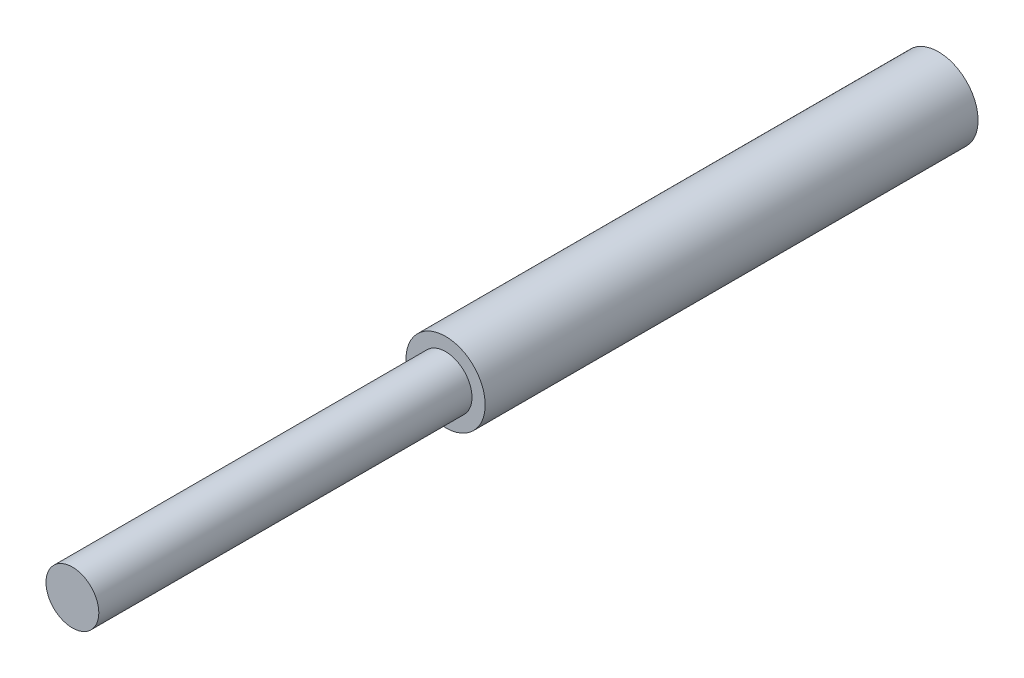
ISO-10303-21;
HEADER;
FILE_DESCRIPTION(('STEP AP214'),'2;1');
FILE_NAME('part.step','',(''),(''),'','','');
FILE_SCHEMA(('AUTOMOTIVE_DESIGN { 1 0 10303 214 1 1 1 1 }'));
ENDSEC;
DATA;
#1=APPLICATION_CONTEXT('core data for automotive mechanical design processes');
#2=APPLICATION_PROTOCOL_DEFINITION('international standard','automotive_design',2000,#1);
#3=PRODUCT_CONTEXT('',#1,'mechanical');
#4=PRODUCT('Part','Part','',(#3));
#5=PRODUCT_RELATED_PRODUCT_CATEGORY('part','',(#4));
#6=PRODUCT_DEFINITION_FORMATION('','',#4);
#7=PRODUCT_DEFINITION_CONTEXT('part definition',#1,'design');
#8=PRODUCT_DEFINITION('design','',#6,#7);
#9=PRODUCT_DEFINITION_SHAPE('','',#8);
#10=(LENGTH_UNIT() NAMED_UNIT(*) SI_UNIT(.MILLI.,.METRE.));
#11=(NAMED_UNIT(*) PLANE_ANGLE_UNIT() SI_UNIT($,.RADIAN.));
#12=(NAMED_UNIT(*) SI_UNIT($,.STERADIAN.) SOLID_ANGLE_UNIT());
#13=UNCERTAINTY_MEASURE_WITH_UNIT(LENGTH_MEASURE(1.E-05),#10,'distance_accuracy_value','');
#14=(GEOMETRIC_REPRESENTATION_CONTEXT(3) GLOBAL_UNCERTAINTY_ASSIGNED_CONTEXT((#13)) GLOBAL_UNIT_ASSIGNED_CONTEXT((#10,
#11,#12)) REPRESENTATION_CONTEXT('',''));
#15=CARTESIAN_POINT('',(0.,0.,0.));
#16=DIRECTION('',(0.,0.,1.));
#17=DIRECTION('',(1.,0.,0.));
#18=AXIS2_PLACEMENT_3D('',#15,#16,#17);
#19=CARTESIAN_POINT('',(0.,0.,21.2));
#20=DIRECTION('',(0.,0.,-1.));
#21=DIRECTION('',(-1.,0.,0.));
#22=AXIS2_PLACEMENT_3D('',#19,#20,#21);
#23=CYLINDRICAL_SURFACE('',#22,1.5);
#24=CARTESIAN_POINT('',(0.,0.,21.2));
#25=DIRECTION('',(0.,0.,1.));
#26=DIRECTION('',(1.,0.,0.));
#27=AXIS2_PLACEMENT_3D('',#24,#25,#26);
#28=CIRCLE('',#27,1.5);
#29=CARTESIAN_POINT('',(1.5,0.,21.2));
#30=VERTEX_POINT('',#29);
#31=EDGE_CURVE('E10',#30,#30,#28,.T.);
#32=ORIENTED_EDGE('',*,*,#31,.F.);
#33=EDGE_LOOP('',(#32));
#34=FACE_BOUND('',#33,.T.);
#35=CARTESIAN_POINT('',(0.,0.,0.));
#36=DIRECTION('',(0.,0.,-1.));
#37=DIRECTION('',(-1.,0.,0.));
#38=AXIS2_PLACEMENT_3D('',#35,#36,#37);
#39=CIRCLE('',#38,1.5);
#40=CARTESIAN_POINT('',(-1.5,0.,0.));
#41=VERTEX_POINT('',#40);
#42=EDGE_CURVE('E39',#41,#41,#39,.T.);
#43=ORIENTED_EDGE('',*,*,#42,.F.);
#44=EDGE_LOOP('',(#43));
#45=FACE_BOUND('',#44,.T.);
#46=ADVANCED_FACE('F33',(#34,#45),#23,.T.);
#47=CARTESIAN_POINT('',(0.,0.,21.2));
#48=DIRECTION('',(0.,0.,1.));
#49=DIRECTION('',(1.,0.,0.));
#50=AXIS2_PLACEMENT_3D('',#47,#48,#49);
#51=PLANE('',#50);
#52=ORIENTED_EDGE('',*,*,#31,.T.);
#53=EDGE_LOOP('',(#52));
#54=FACE_BOUND('',#53,.T.);
#55=ADVANCED_FACE('F81',(#54),#51,.T.);
#56=CARTESIAN_POINT('',(0.,0.,0.));
#57=DIRECTION('',(0.,0.,-1.));
#58=DIRECTION('',(-1.,0.,0.));
#59=AXIS2_PLACEMENT_3D('',#56,#57,#58);
#60=PLANE('',#59);
#61=CARTESIAN_POINT('',(0.,0.,0.));
#62=DIRECTION('',(0.,0.,-1.));
#63=DIRECTION('',(-1.,0.,0.));
#64=AXIS2_PLACEMENT_3D('',#61,#62,#63);
#65=CIRCLE('',#64,2.25);
#66=CARTESIAN_POINT('',(-2.25,0.,0.));
#67=VERTEX_POINT('',#66);
#68=EDGE_CURVE('E47',#67,#67,#65,.T.);
#69=ORIENTED_EDGE('',*,*,#68,.F.);
#70=EDGE_LOOP('',(#69));
#71=FACE_BOUND('',#70,.T.);
#72=ORIENTED_EDGE('',*,*,#42,.T.);
#73=EDGE_LOOP('',(#72));
#74=FACE_BOUND('',#73,.T.);
#75=ADVANCED_FACE('F76',(#71,#74),#60,.F.);
#76=CARTESIAN_POINT('',(0.,0.,-28.));
#77=DIRECTION('',(0.,0.,1.));
#78=DIRECTION('',(1.,0.,0.));
#79=AXIS2_PLACEMENT_3D('',#76,#77,#78);
#80=CYLINDRICAL_SURFACE('',#79,2.25);
#81=CARTESIAN_POINT('',(0.,0.,-28.));
#82=DIRECTION('',(0.,0.,-1.));
#83=DIRECTION('',(-1.,0.,0.));
#84=AXIS2_PLACEMENT_3D('',#81,#82,#83);
#85=CIRCLE('',#84,2.25);
#86=CARTESIAN_POINT('',(-2.25,0.,-28.));
#87=VERTEX_POINT('',#86);
#88=EDGE_CURVE('E43',#87,#87,#85,.T.);
#89=ORIENTED_EDGE('',*,*,#88,.F.);
#90=EDGE_LOOP('',(#89));
#91=FACE_BOUND('',#90,.T.);
#92=ORIENTED_EDGE('',*,*,#68,.T.);
#93=EDGE_LOOP('',(#92));
#94=FACE_BOUND('',#93,.T.);
#95=ADVANCED_FACE('F70',(#91,#94),#80,.T.);
#96=CARTESIAN_POINT('',(0.,0.,-28.));
#97=DIRECTION('',(0.,0.,-1.));
#98=DIRECTION('',(-1.,0.,0.));
#99=AXIS2_PLACEMENT_3D('',#96,#97,#98);
#100=PLANE('',#99);
#101=CARTESIAN_POINT('',(0.,0.,-28.));
#102=DIRECTION('',(0.,0.,-1.));
#103=DIRECTION('',(-1.,0.,0.));
#104=AXIS2_PLACEMENT_3D('',#101,#102,#103);
#105=CIRCLE('',#104,1.5);
#106=CARTESIAN_POINT('',(-1.5,0.,-28.));
#107=VERTEX_POINT('',#106);
#108=EDGE_CURVE('E53',#107,#107,#105,.T.);
#109=ORIENTED_EDGE('',*,*,#108,.F.);
#110=EDGE_LOOP('',(#109));
#111=FACE_BOUND('',#110,.T.);
#112=ORIENTED_EDGE('',*,*,#88,.T.);
#113=EDGE_LOOP('',(#112));
#114=FACE_BOUND('',#113,.T.);
#115=ADVANCED_FACE('F64',(#111,#114),#100,.T.);
#116=CARTESIAN_POINT('',(0.,0.,-22.));
#117=DIRECTION('',(0.,0.,-1.));
#118=DIRECTION('',(-1.,0.,0.));
#119=AXIS2_PLACEMENT_3D('',#116,#117,#118);
#120=CYLINDRICAL_SURFACE('',#119,1.5);
#121=CARTESIAN_POINT('',(0.,0.,-22.));
#122=DIRECTION('',(0.,0.,-1.));
#123=DIRECTION('',(-1.,0.,0.));
#124=AXIS2_PLACEMENT_3D('',#121,#122,#123);
#125=CIRCLE('',#124,1.5);
#126=CARTESIAN_POINT('',(-1.5,0.,-22.));
#127=VERTEX_POINT('',#126);
#128=EDGE_CURVE('E51',#127,#127,#125,.T.);
#129=ORIENTED_EDGE('',*,*,#128,.F.);
#130=EDGE_LOOP('',(#129));
#131=FACE_BOUND('',#130,.T.);
#132=ORIENTED_EDGE('',*,*,#108,.T.);
#133=EDGE_LOOP('',(#132));
#134=FACE_BOUND('',#133,.T.);
#135=ADVANCED_FACE('F61',(#131,#134),#120,.F.);
#136=CARTESIAN_POINT('',(0.,0.,-22.));
#137=DIRECTION('',(0.,0.,-1.));
#138=DIRECTION('',(-1.,0.,0.));
#139=AXIS2_PLACEMENT_3D('',#136,#137,#138);
#140=PLANE('',#139);
#141=ORIENTED_EDGE('',*,*,#128,.T.);
#142=EDGE_LOOP('',(#141));
#143=FACE_BOUND('',#142,.T.);
#144=ADVANCED_FACE('F59',(#143),#140,.T.);
#145=CLOSED_SHELL('',(#46,#55,#75,#95,#115,#135,#144));
#146=MANIFOLD_SOLID_BREP('B2',#145);
#147=ADVANCED_BREP_SHAPE_REPRESENTATION('',(#18,#146),#14);
#148=SHAPE_DEFINITION_REPRESENTATION(#9,#147);
ENDSEC;
END-ISO-10303-21;
